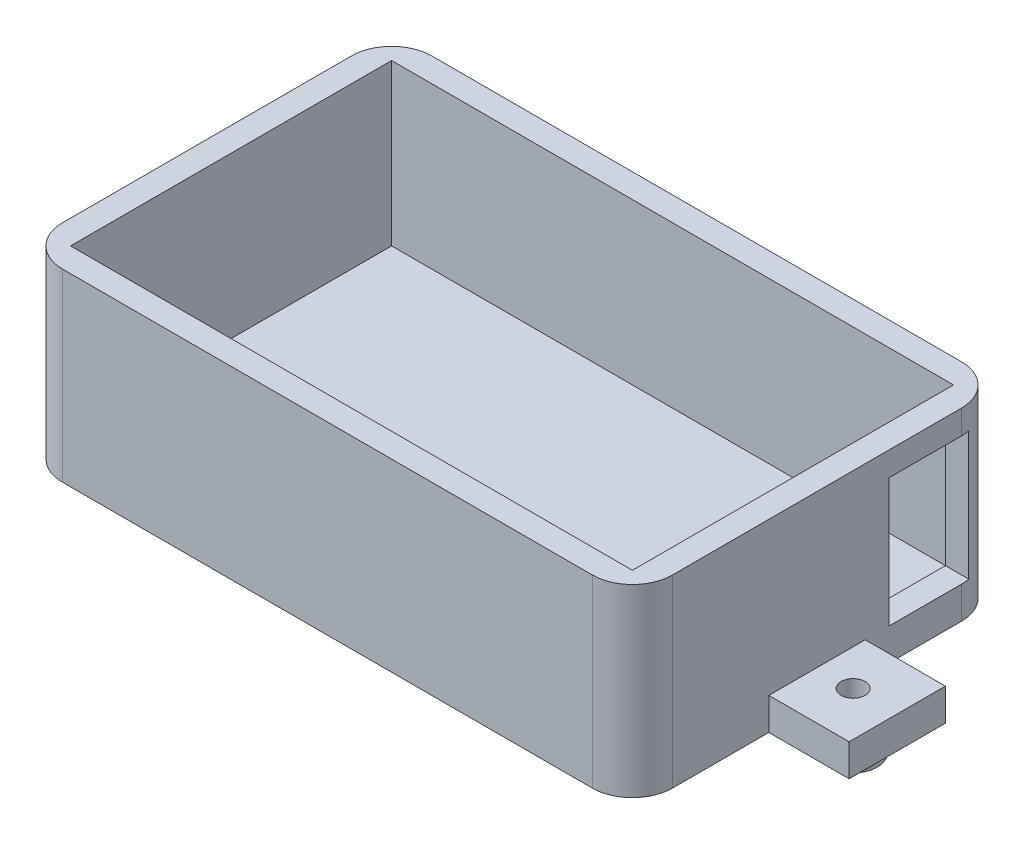
ISO-10303-21;
HEADER;
FILE_DESCRIPTION(('STEP AP214'),'2;1');
FILE_NAME('part.step','',(''),(''),'','','');
FILE_SCHEMA(('AUTOMOTIVE_DESIGN { 1 0 10303 214 1 1 1 1 }'));
ENDSEC;
DATA;
#1=APPLICATION_CONTEXT('core data for automotive mechanical design processes');
#2=APPLICATION_PROTOCOL_DEFINITION('international standard','automotive_design',2000,#1);
#3=PRODUCT_CONTEXT('',#1,'mechanical');
#4=PRODUCT('Part','Part','',(#3));
#5=PRODUCT_RELATED_PRODUCT_CATEGORY('part','',(#4));
#6=PRODUCT_DEFINITION_FORMATION('','',#4);
#7=PRODUCT_DEFINITION_CONTEXT('part definition',#1,'design');
#8=PRODUCT_DEFINITION('design','',#6,#7);
#9=PRODUCT_DEFINITION_SHAPE('','',#8);
#10=(LENGTH_UNIT() NAMED_UNIT(*) SI_UNIT(.MILLI.,.METRE.));
#11=(NAMED_UNIT(*) PLANE_ANGLE_UNIT() SI_UNIT($,.RADIAN.));
#12=(NAMED_UNIT(*) SI_UNIT($,.STERADIAN.) SOLID_ANGLE_UNIT());
#13=UNCERTAINTY_MEASURE_WITH_UNIT(LENGTH_MEASURE(1.E-05),#10,'distance_accuracy_value','');
#14=(GEOMETRIC_REPRESENTATION_CONTEXT(3) GLOBAL_UNCERTAINTY_ASSIGNED_CONTEXT((#13)) GLOBAL_UNIT_ASSIGNED_CONTEXT((#10,
#11,#12)) REPRESENTATION_CONTEXT('',''));
#15=CARTESIAN_POINT('',(0.,0.,0.));
#16=DIRECTION('',(0.,0.,1.));
#17=DIRECTION('',(1.,0.,0.));
#18=AXIS2_PLACEMENT_3D('',#15,#16,#17);
#19=CARTESIAN_POINT('',(38.,20.,23.));
#20=DIRECTION('',(-1.,0.,0.));
#21=DIRECTION('',(0.,0.,1.));
#22=AXIS2_PLACEMENT_3D('',#19,#20,#21);
#23=PLANE('',#22);
#24=DIRECTION('',(0.,0.,1.));
#25=VECTOR('',#24,1.);
#26=CARTESIAN_POINT('',(38.,-3.,23.));
#27=LINE('',#26,#25);
#28=CARTESIAN_POINT('',(38.,-3.,-18.));
#29=VERTEX_POINT('',#28);
#30=CARTESIAN_POINT('',(38.,-2.99999999999999,-6.));
#31=VERTEX_POINT('',#30);
#32=EDGE_CURVE('E336',#29,#31,#27,.T.);
#33=ORIENTED_EDGE('',*,*,#32,.F.);
#34=DIRECTION('',(0.,-1.,0.));
#35=VECTOR('',#34,1.);
#36=CARTESIAN_POINT('',(38.,20.,-18.));
#37=LINE('',#36,#35);
#38=CARTESIAN_POINT('',(38.,1.00000000000001,-18.));
#39=VERTEX_POINT('',#38);
#40=EDGE_CURVE('E242',#29,#39,#37,.F.);
#41=ORIENTED_EDGE('',*,*,#40,.T.);
#42=DIRECTION('',(0.,0.,1.));
#43=VECTOR('',#42,1.);
#44=CARTESIAN_POINT('',(38.,1.00000000000001,-19.));
#45=LINE('',#44,#43);
#46=CARTESIAN_POINT('',(38.,1.00000000000001,-9.00000000000001));
#47=VERTEX_POINT('',#46);
#48=EDGE_CURVE('E235',#39,#47,#45,.T.);
#49=ORIENTED_EDGE('',*,*,#48,.T.);
#50=DIRECTION('',(0.,-1.,0.));
#51=VECTOR('',#50,1.);
#52=CARTESIAN_POINT('',(38.,17.,-9.00000000000001));
#53=LINE('',#52,#51);
#54=CARTESIAN_POINT('',(38.,17.,-9.00000000000001));
#55=VERTEX_POINT('',#54);
#56=EDGE_CURVE('E240',#55,#47,#53,.T.);
#57=ORIENTED_EDGE('',*,*,#56,.F.);
#58=DIRECTION('',(0.,0.,1.));
#59=VECTOR('',#58,1.);
#60=CARTESIAN_POINT('',(38.,17.,-19.));
#61=LINE('',#60,#59);
#62=CARTESIAN_POINT('',(38.,17.,-18.));
#63=VERTEX_POINT('',#62);
#64=EDGE_CURVE('E260',#63,#55,#61,.T.);
#65=ORIENTED_EDGE('',*,*,#64,.F.);
#66=DIRECTION('',(0.,-1.,0.));
#67=VECTOR('',#66,1.);
#68=CARTESIAN_POINT('',(38.,20.,-18.));
#69=LINE('',#68,#67);
#70=CARTESIAN_POINT('',(38.,20.,-18.));
#71=VERTEX_POINT('',#70);
#72=EDGE_CURVE('E520',#63,#71,#69,.F.);
#73=ORIENTED_EDGE('',*,*,#72,.T.);
#74=DIRECTION('',(0.,0.,-1.));
#75=VECTOR('',#74,1.);
#76=CARTESIAN_POINT('',(38.,20.,23.));
#77=LINE('',#76,#75);
#78=CARTESIAN_POINT('',(38.,20.,18.));
#79=VERTEX_POINT('',#78);
#80=EDGE_CURVE('E387',#79,#71,#77,.T.);
#81=ORIENTED_EDGE('',*,*,#80,.F.);
#82=DIRECTION('',(0.,-1.,0.));
#83=VECTOR('',#82,1.);
#84=CARTESIAN_POINT('',(38.,20.,18.));
#85=LINE('',#84,#83);
#86=CARTESIAN_POINT('',(38.,-3.,18.));
#87=VERTEX_POINT('',#86);
#88=EDGE_CURVE('E516',#79,#87,#85,.T.);
#89=ORIENTED_EDGE('',*,*,#88,.T.);
#90=CARTESIAN_POINT('',(38.,-3.,6.));
#91=VERTEX_POINT('',#90);
#92=EDGE_CURVE('E335',#91,#87,#27,.T.);
#93=ORIENTED_EDGE('',*,*,#92,.F.);
#94=DIRECTION('',(0.,1.,0.));
#95=VECTOR('',#94,1.);
#96=CARTESIAN_POINT('',(38.,-3.,6.));
#97=LINE('',#96,#95);
#98=CARTESIAN_POINT('',(38.,1.,6.));
#99=VERTEX_POINT('',#98);
#100=EDGE_CURVE('E307',#91,#99,#97,.T.);
#101=ORIENTED_EDGE('',*,*,#100,.T.);
#102=DIRECTION('',(0.,0.,1.));
#103=VECTOR('',#102,1.);
#104=CARTESIAN_POINT('',(38.,1.00000000000001,-6.));
#105=LINE('',#104,#103);
#106=CARTESIAN_POINT('',(38.,1.00000000000001,-6.));
#107=VERTEX_POINT('',#106);
#108=EDGE_CURVE('E282',#107,#99,#105,.T.);
#109=ORIENTED_EDGE('',*,*,#108,.F.);
#110=DIRECTION('',(0.,1.,0.));
#111=VECTOR('',#110,1.);
#112=CARTESIAN_POINT('',(38.,-2.99999999999999,-6.));
#113=LINE('',#112,#111);
#114=EDGE_CURVE('E293',#31,#107,#113,.T.);
#115=ORIENTED_EDGE('',*,*,#114,.F.);
#116=EDGE_LOOP('',(#33,#41,#49,#57,#65,#73,#81,#89,#93,#101,#109,#115));
#117=FACE_BOUND('',#116,.T.);
#118=ADVANCED_FACE('F68',(#117),#23,.F.);
#119=CARTESIAN_POINT('',(35.,20.,-20.));
#120=DIRECTION('',(-1.,0.,0.));
#121=DIRECTION('',(0.,0.,1.));
#122=AXIS2_PLACEMENT_3D('',#119,#120,#121);
#123=PLANE('',#122);
#124=DIRECTION('',(0.,0.,-1.));
#125=VECTOR('',#124,1.);
#126=CARTESIAN_POINT('',(35.,0.,-20.));
#127=LINE('',#126,#125);
#128=CARTESIAN_POINT('',(35.,0.,20.));
#129=VERTEX_POINT('',#128);
#130=CARTESIAN_POINT('',(35.,0.,-20.));
#131=VERTEX_POINT('',#130);
#132=EDGE_CURVE('E343',#129,#131,#127,.T.);
#133=ORIENTED_EDGE('',*,*,#132,.F.);
#134=DIRECTION('',(0.,-1.,0.));
#135=VECTOR('',#134,1.);
#136=CARTESIAN_POINT('',(35.,20.,20.));
#137=LINE('',#136,#135);
#138=CARTESIAN_POINT('',(35.,20.,20.));
#139=VERTEX_POINT('',#138);
#140=EDGE_CURVE('E358',#139,#129,#137,.T.);
#141=ORIENTED_EDGE('',*,*,#140,.F.);
#142=DIRECTION('',(0.,0.,-1.));
#143=VECTOR('',#142,1.);
#144=CARTESIAN_POINT('',(35.,20.,-20.));
#145=LINE('',#144,#143);
#146=CARTESIAN_POINT('',(35.,20.,-20.));
#147=VERTEX_POINT('',#146);
#148=EDGE_CURVE('E344',#139,#147,#145,.T.);
#149=ORIENTED_EDGE('',*,*,#148,.T.);
#150=DIRECTION('',(0.,-1.,0.));
#151=VECTOR('',#150,1.);
#152=CARTESIAN_POINT('',(35.,20.,-20.));
#153=LINE('',#152,#151);
#154=EDGE_CURVE('E383',#147,#131,#153,.T.);
#155=ORIENTED_EDGE('',*,*,#154,.T.);
#156=EDGE_LOOP('',(#133,#141,#149,#155));
#157=FACE_BOUND('',#156,.T.);
#158=DIRECTION('',(0.,1.,0.));
#159=VECTOR('',#158,1.);
#160=CARTESIAN_POINT('',(35.,20.,-9.00000000000001));
#161=LINE('',#160,#159);
#162=CARTESIAN_POINT('',(35.,1.00000000000001,-9.00000000000001));
#163=VERTEX_POINT('',#162);
#164=CARTESIAN_POINT('',(35.,17.,-9.00000000000001));
#165=VERTEX_POINT('',#164);
#166=EDGE_CURVE('E466',#163,#165,#161,.T.);
#167=ORIENTED_EDGE('',*,*,#166,.F.);
#168=DIRECTION('',(0.,0.,-1.));
#169=VECTOR('',#168,1.);
#170=CARTESIAN_POINT('',(35.,1.,-20.));
#171=LINE('',#170,#169);
#172=CARTESIAN_POINT('',(35.,1.00000000000001,-19.));
#173=VERTEX_POINT('',#172);
#174=EDGE_CURVE('E249',#163,#173,#171,.T.);
#175=ORIENTED_EDGE('',*,*,#174,.T.);
#176=DIRECTION('',(0.,1.,0.));
#177=VECTOR('',#176,1.);
#178=CARTESIAN_POINT('',(35.,20.,-19.));
#179=LINE('',#178,#177);
#180=CARTESIAN_POINT('',(35.,17.,-19.));
#181=VERTEX_POINT('',#180);
#182=EDGE_CURVE('E445',#173,#181,#179,.T.);
#183=ORIENTED_EDGE('',*,*,#182,.T.);
#184=DIRECTION('',(0.,0.,-1.));
#185=VECTOR('',#184,1.);
#186=CARTESIAN_POINT('',(35.,17.,-20.));
#187=LINE('',#186,#185);
#188=EDGE_CURVE('E462',#165,#181,#187,.T.);
#189=ORIENTED_EDGE('',*,*,#188,.F.);
#190=EDGE_LOOP('',(#167,#175,#183,#189));
#191=FACE_BOUND('',#190,.T.);
#192=ADVANCED_FACE('F608',(#157,#191),#123,.T.);
#193=CARTESIAN_POINT('',(-42.5,1.,0.));
#194=DIRECTION('',(0.,-1.,0.));
#195=DIRECTION('',(0.,0.,-1.));
#196=AXIS2_PLACEMENT_3D('',#193,#194,#195);
#197=CYLINDRICAL_SURFACE('',#196,3.);
#198=CARTESIAN_POINT('',(-42.5,-3.,0.));
#199=DIRECTION('',(0.,-1.,0.));
#200=DIRECTION('',(0.,0.,-1.));
#201=AXIS2_PLACEMENT_3D('',#198,#199,#200);
#202=CIRCLE('',#201,3.);
#203=CARTESIAN_POINT('',(-42.5,-3.,-3.00000000000001));
#204=VERTEX_POINT('',#203);
#205=EDGE_CURVE('E441',#204,#204,#202,.F.);
#206=ORIENTED_EDGE('',*,*,#205,.F.);
#207=EDGE_LOOP('',(#206));
#208=FACE_BOUND('',#207,.T.);
#209=CARTESIAN_POINT('',(-42.5,-6.,0.));
#210=DIRECTION('',(0.,-1.,0.));
#211=DIRECTION('',(0.,0.,-1.));
#212=AXIS2_PLACEMENT_3D('',#209,#210,#211);
#213=CIRCLE('',#212,3.);
#214=CARTESIAN_POINT('',(-42.5,-6.,-3.00000000000001));
#215=VERTEX_POINT('',#214);
#216=EDGE_CURVE('E446',#215,#215,#213,.T.);
#217=ORIENTED_EDGE('',*,*,#216,.F.);
#218=EDGE_LOOP('',(#217));
#219=FACE_BOUND('',#218,.T.);
#220=ADVANCED_FACE('F614',(#208,#219),#197,.T.);
#221=CARTESIAN_POINT('',(-42.5,1.,0.));
#222=DIRECTION('',(0.,-1.,0.));
#223=DIRECTION('',(0.,0.,-1.));
#224=AXIS2_PLACEMENT_3D('',#221,#222,#223);
#225=CYLINDRICAL_SURFACE('',#224,1.5);
#226=CARTESIAN_POINT('',(-42.5,-6.,0.));
#227=DIRECTION('',(0.,-1.,0.));
#228=DIRECTION('',(0.,0.,-1.));
#229=AXIS2_PLACEMENT_3D('',#226,#227,#228);
#230=CIRCLE('',#229,1.5);
#231=CARTESIAN_POINT('',(-42.5,-6.,-1.50000000000001));
#232=VERTEX_POINT('',#231);
#233=EDGE_CURVE('E440',#232,#232,#230,.T.);
#234=ORIENTED_EDGE('',*,*,#233,.T.);
#235=EDGE_LOOP('',(#234));
#236=FACE_BOUND('',#235,.T.);
#237=CARTESIAN_POINT('',(-42.5,1.,0.));
#238=DIRECTION('',(0.,-1.,0.));
#239=DIRECTION('',(0.,0.,-1.));
#240=AXIS2_PLACEMENT_3D('',#237,#238,#239);
#241=CIRCLE('',#240,1.5);
#242=CARTESIAN_POINT('',(-42.5,1.,-1.50000000000001));
#243=VERTEX_POINT('',#242);
#244=EDGE_CURVE('E278',#243,#243,#241,.T.);
#245=ORIENTED_EDGE('',*,*,#244,.F.);
#246=EDGE_LOOP('',(#245));
#247=FACE_BOUND('',#246,.T.);
#248=ADVANCED_FACE('F604',(#236,#247),#225,.F.);
#249=CARTESIAN_POINT('',(-42.5,-6.,0.));
#250=DIRECTION('',(0.,-1.,0.));
#251=DIRECTION('',(0.,0.,-1.));
#252=AXIS2_PLACEMENT_3D('',#249,#250,#251);
#253=PLANE('',#252);
#254=ORIENTED_EDGE('',*,*,#216,.T.);
#255=EDGE_LOOP('',(#254));
#256=FACE_BOUND('',#255,.T.);
#257=ORIENTED_EDGE('',*,*,#233,.F.);
#258=EDGE_LOOP('',(#257));
#259=FACE_BOUND('',#258,.T.);
#260=ADVANCED_FACE('F594',(#256,#259),#253,.T.);
#261=CARTESIAN_POINT('',(-48.,-3.,-6.));
#262=DIRECTION('',(0.,0.,-1.));
#263=DIRECTION('',(-1.,0.,0.));
#264=AXIS2_PLACEMENT_3D('',#261,#262,#263);
#265=PLANE('',#264);
#266=DIRECTION('',(0.,1.,0.));
#267=VECTOR('',#266,1.);
#268=CARTESIAN_POINT('',(-38.,-3.,-6.));
#269=LINE('',#268,#267);
#270=CARTESIAN_POINT('',(-38.,-3.,-6.));
#271=VERTEX_POINT('',#270);
#272=CARTESIAN_POINT('',(-38.,1.,-6.));
#273=VERTEX_POINT('',#272);
#274=EDGE_CURVE('E420',#271,#273,#269,.T.);
#275=ORIENTED_EDGE('',*,*,#274,.F.);
#276=DIRECTION('',(1.,0.,0.));
#277=VECTOR('',#276,1.);
#278=CARTESIAN_POINT('',(-48.,-3.,-6.));
#279=LINE('',#278,#277);
#280=CARTESIAN_POINT('',(-48.,-3.,-6.));
#281=VERTEX_POINT('',#280);
#282=EDGE_CURVE('E433',#281,#271,#279,.T.);
#283=ORIENTED_EDGE('',*,*,#282,.F.);
#284=DIRECTION('',(0.,1.,0.));
#285=VECTOR('',#284,1.);
#286=CARTESIAN_POINT('',(-48.,-3.,-6.));
#287=LINE('',#286,#285);
#288=CARTESIAN_POINT('',(-48.,1.,-6.));
#289=VERTEX_POINT('',#288);
#290=EDGE_CURVE('E405',#281,#289,#287,.T.);
#291=ORIENTED_EDGE('',*,*,#290,.T.);
#292=DIRECTION('',(1.,0.,0.));
#293=VECTOR('',#292,1.);
#294=CARTESIAN_POINT('',(-48.,1.,-6.));
#295=LINE('',#294,#293);
#296=EDGE_CURVE('E436',#289,#273,#295,.T.);
#297=ORIENTED_EDGE('',*,*,#296,.T.);
#298=EDGE_LOOP('',(#275,#283,#291,#297));
#299=FACE_BOUND('',#298,.T.);
#300=ADVANCED_FACE('F592',(#299),#265,.T.);
#301=CARTESIAN_POINT('',(-48.,-2.99999999999999,6.));
#302=DIRECTION('',(0.,-1.,0.));
#303=DIRECTION('',(0.,0.,-1.));
#304=AXIS2_PLACEMENT_3D('',#301,#302,#303);
#305=PLANE('',#304);
#306=ORIENTED_EDGE('',*,*,#205,.T.);
#307=EDGE_LOOP('',(#306));
#308=FACE_BOUND('',#307,.T.);
#309=DIRECTION('',(-1.,0.,0.));
#310=VECTOR('',#309,1.);
#311=CARTESIAN_POINT('',(-38.,-3.,23.));
#312=LINE('',#311,#310);
#313=CARTESIAN_POINT('',(33.,-3.,23.));
#314=VERTEX_POINT('',#313);
#315=CARTESIAN_POINT('',(-33.,-3.,23.));
#316=VERTEX_POINT('',#315);
#317=EDGE_CURVE('E339',#314,#316,#312,.T.);
#318=ORIENTED_EDGE('',*,*,#317,.T.);
#319=CARTESIAN_POINT('',(-33.,-2.99999999999999,18.));
#320=DIRECTION('',(0.,-1.,0.));
#321=DIRECTION('',(0.,0.,-1.));
#322=AXIS2_PLACEMENT_3D('',#319,#320,#321);
#323=CIRCLE('',#322,5.);
#324=CARTESIAN_POINT('',(-38.,-3.,18.));
#325=VERTEX_POINT('',#324);
#326=EDGE_CURVE('E487',#316,#325,#323,.T.);
#327=ORIENTED_EDGE('',*,*,#326,.T.);
#328=DIRECTION('',(0.,0.,-1.));
#329=VECTOR('',#328,1.);
#330=CARTESIAN_POINT('',(-38.,-3.,23.));
#331=LINE('',#330,#329);
#332=CARTESIAN_POINT('',(-38.,-2.99999999999999,6.));
#333=VERTEX_POINT('',#332);
#334=EDGE_CURVE('E328',#325,#333,#331,.T.);
#335=ORIENTED_EDGE('',*,*,#334,.T.);
#336=DIRECTION('',(1.,0.,0.));
#337=VECTOR('',#336,1.);
#338=CARTESIAN_POINT('',(-48.,-2.99999999999999,6.));
#339=LINE('',#338,#337);
#340=CARTESIAN_POINT('',(-48.,-2.99999999999999,6.));
#341=VERTEX_POINT('',#340);
#342=EDGE_CURVE('E429',#341,#333,#339,.T.);
#343=ORIENTED_EDGE('',*,*,#342,.F.);
#344=DIRECTION('',(0.,0.,-1.));
#345=VECTOR('',#344,1.);
#346=CARTESIAN_POINT('',(-48.,-2.99999999999999,6.));
#347=LINE('',#346,#345);
#348=EDGE_CURVE('E410',#341,#281,#347,.T.);
#349=ORIENTED_EDGE('',*,*,#348,.T.);
#350=ORIENTED_EDGE('',*,*,#282,.T.);
#351=CARTESIAN_POINT('',(-38.,-3.,-18.));
#352=VERTEX_POINT('',#351);
#353=EDGE_CURVE('E327',#271,#352,#331,.T.);
#354=ORIENTED_EDGE('',*,*,#353,.T.);
#355=CARTESIAN_POINT('',(-33.,-3.,-18.));
#356=DIRECTION('',(0.,-1.,0.));
#357=DIRECTION('',(0.,0.,-1.));
#358=AXIS2_PLACEMENT_3D('',#355,#356,#357);
#359=CIRCLE('',#358,5.);
#360=CARTESIAN_POINT('',(-33.,-3.,-23.));
#361=VERTEX_POINT('',#360);
#362=EDGE_CURVE('E484',#352,#361,#359,.T.);
#363=ORIENTED_EDGE('',*,*,#362,.T.);
#364=DIRECTION('',(1.,0.,0.));
#365=VECTOR('',#364,1.);
#366=CARTESIAN_POINT('',(-38.,-3.,-23.));
#367=LINE('',#366,#365);
#368=CARTESIAN_POINT('',(33.,-3.,-23.));
#369=VERTEX_POINT('',#368);
#370=EDGE_CURVE('E331',#361,#369,#367,.T.);
#371=ORIENTED_EDGE('',*,*,#370,.T.);
#372=CARTESIAN_POINT('',(33.,-3.,-18.));
#373=DIRECTION('',(0.,-1.,0.));
#374=DIRECTION('',(0.,0.,-1.));
#375=AXIS2_PLACEMENT_3D('',#372,#373,#374);
#376=CIRCLE('',#375,5.);
#377=EDGE_CURVE('E481',#369,#29,#376,.T.);
#378=ORIENTED_EDGE('',*,*,#377,.T.);
#379=ORIENTED_EDGE('',*,*,#32,.T.);
#380=DIRECTION('',(-1.,0.,0.));
#381=VECTOR('',#380,1.);
#382=CARTESIAN_POINT('',(48.,-2.99999999999999,-6.));
#383=LINE('',#382,#381);
#384=CARTESIAN_POINT('',(48.,-2.99999999999999,-6.));
#385=VERTEX_POINT('',#384);
#386=EDGE_CURVE('E316',#385,#31,#383,.T.);
#387=ORIENTED_EDGE('',*,*,#386,.F.);
#388=DIRECTION('',(0.,0.,1.));
#389=VECTOR('',#388,1.);
#390=CARTESIAN_POINT('',(48.,-2.99999999999999,-6.));
#391=LINE('',#390,#389);
#392=CARTESIAN_POINT('',(48.,-3.,6.));
#393=VERTEX_POINT('',#392);
#394=EDGE_CURVE('E297',#385,#393,#391,.T.);
#395=ORIENTED_EDGE('',*,*,#394,.T.);
#396=DIRECTION('',(-1.,0.,0.));
#397=VECTOR('',#396,1.);
#398=CARTESIAN_POINT('',(48.,-3.,6.));
#399=LINE('',#398,#397);
#400=EDGE_CURVE('E320',#393,#91,#399,.T.);
#401=ORIENTED_EDGE('',*,*,#400,.T.);
#402=ORIENTED_EDGE('',*,*,#92,.T.);
#403=CARTESIAN_POINT('',(33.,-2.99999999999999,18.));
#404=DIRECTION('',(0.,-1.,0.));
#405=DIRECTION('',(0.,0.,-1.));
#406=AXIS2_PLACEMENT_3D('',#403,#404,#405);
#407=CIRCLE('',#406,5.);
#408=EDGE_CURVE('E478',#87,#314,#407,.T.);
#409=ORIENTED_EDGE('',*,*,#408,.T.);
#410=EDGE_LOOP('',(#318,#327,#335,#343,#349,#350,#354,#363,#371,#378,#379,#387,#395,#401,#402,#409));
#411=FACE_BOUND('',#410,.T.);
#412=CARTESIAN_POINT('',(42.5,-3.,0.));
#413=DIRECTION('',(0.,-1.,0.));
#414=DIRECTION('',(0.,0.,-1.));
#415=AXIS2_PLACEMENT_3D('',#412,#413,#414);
#416=CIRCLE('',#415,2.99999999999999);
#417=CARTESIAN_POINT('',(42.5,-3.,-2.99999999999999));
#418=VERTEX_POINT('',#417);
#419=EDGE_CURVE('E283',#418,#418,#416,.T.);
#420=ORIENTED_EDGE('',*,*,#419,.F.);
#421=EDGE_LOOP('',(#420));
#422=FACE_BOUND('',#421,.T.);
#423=ADVANCED_FACE('F533',(#308,#411,#422),#305,.T.);
#424=CARTESIAN_POINT('',(-48.,-2.99999999999999,6.));
#425=DIRECTION('',(0.,0.,-1.));
#426=DIRECTION('',(-1.,0.,0.));
#427=AXIS2_PLACEMENT_3D('',#424,#425,#426);
#428=PLANE('',#427);
#429=DIRECTION('',(0.,1.,0.));
#430=VECTOR('',#429,1.);
#431=CARTESIAN_POINT('',(-38.,-2.99999999999999,6.));
#432=LINE('',#431,#430);
#433=CARTESIAN_POINT('',(-38.,1.00000000000001,6.));
#434=VERTEX_POINT('',#433);
#435=EDGE_CURVE('E406',#333,#434,#432,.T.);
#436=ORIENTED_EDGE('',*,*,#435,.T.);
#437=DIRECTION('',(1.,0.,0.));
#438=VECTOR('',#437,1.);
#439=CARTESIAN_POINT('',(-48.,1.00000000000001,6.));
#440=LINE('',#439,#438);
#441=CARTESIAN_POINT('',(-48.,1.00000000000001,6.));
#442=VERTEX_POINT('',#441);
#443=EDGE_CURVE('E417',#442,#434,#440,.T.);
#444=ORIENTED_EDGE('',*,*,#443,.F.);
#445=DIRECTION('',(0.,1.,0.));
#446=VECTOR('',#445,1.);
#447=CARTESIAN_POINT('',(-48.,-2.99999999999999,6.));
#448=LINE('',#447,#446);
#449=EDGE_CURVE('E414',#341,#442,#448,.T.);
#450=ORIENTED_EDGE('',*,*,#449,.F.);
#451=ORIENTED_EDGE('',*,*,#342,.T.);
#452=EDGE_LOOP('',(#436,#444,#450,#451));
#453=FACE_BOUND('',#452,.T.);
#454=ADVANCED_FACE('F581',(#453),#428,.F.);
#455=CARTESIAN_POINT('',(-48.,0.,0.));
#456=DIRECTION('',(1.,0.,0.));
#457=DIRECTION('',(0.,0.,-1.));
#458=AXIS2_PLACEMENT_3D('',#455,#456,#457);
#459=PLANE('',#458);
#460=DIRECTION('',(0.,0.,-1.));
#461=VECTOR('',#460,1.);
#462=CARTESIAN_POINT('',(-48.,1.00000000000001,6.));
#463=LINE('',#462,#461);
#464=EDGE_CURVE('E402',#442,#289,#463,.T.);
#465=ORIENTED_EDGE('',*,*,#464,.T.);
#466=ORIENTED_EDGE('',*,*,#290,.F.);
#467=ORIENTED_EDGE('',*,*,#348,.F.);
#468=ORIENTED_EDGE('',*,*,#449,.T.);
#469=EDGE_LOOP('',(#465,#466,#467,#468));
#470=FACE_BOUND('',#469,.T.);
#471=ADVANCED_FACE('F589',(#470),#459,.F.);
#472=CARTESIAN_POINT('',(-42.5,1.,0.));
#473=DIRECTION('',(0.,-1.,0.));
#474=DIRECTION('',(0.,0.,-1.));
#475=AXIS2_PLACEMENT_3D('',#472,#473,#474);
#476=PLANE('',#475);
#477=ORIENTED_EDGE('',*,*,#244,.T.);
#478=EDGE_LOOP('',(#477));
#479=FACE_BOUND('',#478,.T.);
#480=DIRECTION('',(0.,0.,-1.));
#481=VECTOR('',#480,1.);
#482=CARTESIAN_POINT('',(-38.,1.00000000000001,6.));
#483=LINE('',#482,#481);
#484=EDGE_CURVE('E287',#434,#273,#483,.T.);
#485=ORIENTED_EDGE('',*,*,#484,.T.);
#486=ORIENTED_EDGE('',*,*,#296,.F.);
#487=ORIENTED_EDGE('',*,*,#464,.F.);
#488=ORIENTED_EDGE('',*,*,#443,.T.);
#489=EDGE_LOOP('',(#485,#486,#487,#488));
#490=FACE_BOUND('',#489,.T.);
#491=ADVANCED_FACE('F585',(#479,#490),#476,.F.);
#492=CARTESIAN_POINT('',(0.,20.,0.));
#493=DIRECTION('',(0.,-1.,0.));
#494=DIRECTION('',(0.,0.,-1.));
#495=AXIS2_PLACEMENT_3D('',#492,#493,#494);
#496=PLANE('',#495);
#497=DIRECTION('',(0.,0.,1.));
#498=VECTOR('',#497,1.);
#499=CARTESIAN_POINT('',(-38.,20.,23.));
#500=LINE('',#499,#498);
#501=CARTESIAN_POINT('',(-38.,20.,-18.));
#502=VERTEX_POINT('',#501);
#503=CARTESIAN_POINT('',(-38.,20.,18.));
#504=VERTEX_POINT('',#503);
#505=EDGE_CURVE('E395',#502,#504,#500,.T.);
#506=ORIENTED_EDGE('',*,*,#505,.T.);
#507=CARTESIAN_POINT('',(-33.,20.,18.));
#508=DIRECTION('',(0.,-1.,0.));
#509=DIRECTION('',(0.,0.,-1.));
#510=AXIS2_PLACEMENT_3D('',#507,#508,#509);
#511=CIRCLE('',#510,5.);
#512=CARTESIAN_POINT('',(-33.,20.,23.));
#513=VERTEX_POINT('',#512);
#514=EDGE_CURVE('E506',#504,#513,#511,.F.);
#515=ORIENTED_EDGE('',*,*,#514,.T.);
#516=DIRECTION('',(1.,0.,0.));
#517=VECTOR('',#516,1.);
#518=CARTESIAN_POINT('',(-38.,20.,23.));
#519=LINE('',#518,#517);
#520=CARTESIAN_POINT('',(33.,20.,23.));
#521=VERTEX_POINT('',#520);
#522=EDGE_CURVE('E288',#513,#521,#519,.T.);
#523=ORIENTED_EDGE('',*,*,#522,.T.);
#524=CARTESIAN_POINT('',(33.,20.,18.));
#525=DIRECTION('',(0.,-1.,0.));
#526=DIRECTION('',(0.,0.,-1.));
#527=AXIS2_PLACEMENT_3D('',#524,#525,#526);
#528=CIRCLE('',#527,5.);
#529=EDGE_CURVE('E497',#521,#79,#528,.F.);
#530=ORIENTED_EDGE('',*,*,#529,.T.);
#531=ORIENTED_EDGE('',*,*,#80,.T.);
#532=CARTESIAN_POINT('',(33.,20.,-18.));
#533=DIRECTION('',(0.,-1.,0.));
#534=DIRECTION('',(0.,0.,-1.));
#535=AXIS2_PLACEMENT_3D('',#532,#533,#534);
#536=CIRCLE('',#535,5.);
#537=CARTESIAN_POINT('',(33.,20.,-23.));
#538=VERTEX_POINT('',#537);
#539=EDGE_CURVE('E500',#71,#538,#536,.F.);
#540=ORIENTED_EDGE('',*,*,#539,.T.);
#541=DIRECTION('',(-1.,0.,0.));
#542=VECTOR('',#541,1.);
#543=CARTESIAN_POINT('',(-38.,20.,-23.));
#544=LINE('',#543,#542);
#545=CARTESIAN_POINT('',(-33.,20.,-23.));
#546=VERTEX_POINT('',#545);
#547=EDGE_CURVE('E391',#538,#546,#544,.T.);
#548=ORIENTED_EDGE('',*,*,#547,.T.);
#549=CARTESIAN_POINT('',(-33.,20.,-18.));
#550=DIRECTION('',(0.,-1.,0.));
#551=DIRECTION('',(0.,0.,-1.));
#552=AXIS2_PLACEMENT_3D('',#549,#550,#551);
#553=CIRCLE('',#552,5.);
#554=EDGE_CURVE('E503',#546,#502,#553,.F.);
#555=ORIENTED_EDGE('',*,*,#554,.T.);
#556=EDGE_LOOP('',(#506,#515,#523,#530,#531,#540,#548,#555));
#557=FACE_BOUND('',#556,.T.);
#558=ORIENTED_EDGE('',*,*,#148,.F.);
#559=DIRECTION('',(1.,0.,0.));
#560=VECTOR('',#559,1.);
#561=CARTESIAN_POINT('',(-35.,20.,20.));
#562=LINE('',#561,#560);
#563=CARTESIAN_POINT('',(-35.,20.,20.));
#564=VERTEX_POINT('',#563);
#565=EDGE_CURVE('E355',#564,#139,#562,.T.);
#566=ORIENTED_EDGE('',*,*,#565,.F.);
#567=DIRECTION('',(0.,0.,1.));
#568=VECTOR('',#567,1.);
#569=CARTESIAN_POINT('',(-35.,20.,-20.));
#570=LINE('',#569,#568);
#571=CARTESIAN_POINT('',(-35.,20.,-20.));
#572=VERTEX_POINT('',#571);
#573=EDGE_CURVE('E351',#572,#564,#570,.T.);
#574=ORIENTED_EDGE('',*,*,#573,.F.);
#575=DIRECTION('',(-1.,0.,0.));
#576=VECTOR('',#575,1.);
#577=CARTESIAN_POINT('',(-35.,20.,-20.));
#578=LINE('',#577,#576);
#579=EDGE_CURVE('E347',#147,#572,#578,.T.);
#580=ORIENTED_EDGE('',*,*,#579,.F.);
#581=EDGE_LOOP('',(#558,#566,#574,#580));
#582=FACE_BOUND('',#581,.T.);
#583=ADVANCED_FACE('F552',(#557,#582),#496,.F.);
#584=CARTESIAN_POINT('',(-38.,20.,-23.));
#585=DIRECTION('',(0.,0.,1.));
#586=DIRECTION('',(1.,0.,0.));
#587=AXIS2_PLACEMENT_3D('',#584,#585,#586);
#588=PLANE('',#587);
#589=ORIENTED_EDGE('',*,*,#370,.F.);
#590=DIRECTION('',(0.,-1.,0.));
#591=VECTOR('',#590,1.);
#592=CARTESIAN_POINT('',(-33.,20.,-23.));
#593=LINE('',#592,#591);
#594=EDGE_CURVE('E513',#361,#546,#593,.F.);
#595=ORIENTED_EDGE('',*,*,#594,.T.);
#596=ORIENTED_EDGE('',*,*,#547,.F.);
#597=DIRECTION('',(0.,-1.,0.));
#598=VECTOR('',#597,1.);
#599=CARTESIAN_POINT('',(33.,20.,-23.));
#600=LINE('',#599,#598);
#601=EDGE_CURVE('E509',#538,#369,#600,.T.);
#602=ORIENTED_EDGE('',*,*,#601,.T.);
#603=EDGE_LOOP('',(#589,#595,#596,#602));
#604=FACE_BOUND('',#603,.T.);
#605=ADVANCED_FACE('F549',(#604),#588,.F.);
#606=CARTESIAN_POINT('',(-38.,20.,23.));
#607=DIRECTION('',(1.,0.,0.));
#608=DIRECTION('',(0.,0.,-1.));
#609=AXIS2_PLACEMENT_3D('',#606,#607,#608);
#610=PLANE('',#609);
#611=ORIENTED_EDGE('',*,*,#334,.F.);
#612=DIRECTION('',(0.,-1.,0.));
#613=VECTOR('',#612,1.);
#614=CARTESIAN_POINT('',(-38.,20.,18.));
#615=LINE('',#614,#613);
#616=EDGE_CURVE('E494',#325,#504,#615,.F.);
#617=ORIENTED_EDGE('',*,*,#616,.T.);
#618=ORIENTED_EDGE('',*,*,#505,.F.);
#619=DIRECTION('',(0.,-1.,0.));
#620=VECTOR('',#619,1.);
#621=CARTESIAN_POINT('',(-38.,20.,-18.));
#622=LINE('',#621,#620);
#623=EDGE_CURVE('E490',#502,#352,#622,.T.);
#624=ORIENTED_EDGE('',*,*,#623,.T.);
#625=ORIENTED_EDGE('',*,*,#353,.F.);
#626=ORIENTED_EDGE('',*,*,#274,.T.);
#627=ORIENTED_EDGE('',*,*,#484,.F.);
#628=ORIENTED_EDGE('',*,*,#435,.F.);
#629=EDGE_LOOP('',(#611,#617,#618,#624,#625,#626,#627,#628));
#630=FACE_BOUND('',#629,.T.);
#631=ADVANCED_FACE('F539',(#630),#610,.F.);
#632=CARTESIAN_POINT('',(-38.,20.,23.));
#633=DIRECTION('',(0.,0.,-1.));
#634=DIRECTION('',(-1.,0.,0.));
#635=AXIS2_PLACEMENT_3D('',#632,#633,#634);
#636=PLANE('',#635);
#637=ORIENTED_EDGE('',*,*,#522,.F.);
#638=DIRECTION('',(0.,-1.,0.));
#639=VECTOR('',#638,1.);
#640=CARTESIAN_POINT('',(-33.,20.,23.));
#641=LINE('',#640,#639);
#642=EDGE_CURVE('E474',#513,#316,#641,.T.);
#643=ORIENTED_EDGE('',*,*,#642,.T.);
#644=ORIENTED_EDGE('',*,*,#317,.F.);
#645=DIRECTION('',(0.,-1.,0.));
#646=VECTOR('',#645,1.);
#647=CARTESIAN_POINT('',(33.,20.,23.));
#648=LINE('',#647,#646);
#649=EDGE_CURVE('E471',#314,#521,#648,.F.);
#650=ORIENTED_EDGE('',*,*,#649,.T.);
#651=EDGE_LOOP('',(#637,#643,#644,#650));
#652=FACE_BOUND('',#651,.T.);
#653=ADVANCED_FACE('F572',(#652),#636,.F.);
#654=CARTESIAN_POINT('',(-35.,20.,-20.));
#655=DIRECTION('',(0.,0.,1.));
#656=DIRECTION('',(1.,0.,0.));
#657=AXIS2_PLACEMENT_3D('',#654,#655,#656);
#658=PLANE('',#657);
#659=DIRECTION('',(-1.,0.,0.));
#660=VECTOR('',#659,1.);
#661=CARTESIAN_POINT('',(-35.,0.,-20.));
#662=LINE('',#661,#660);
#663=CARTESIAN_POINT('',(-35.,0.,-20.));
#664=VERTEX_POINT('',#663);
#665=EDGE_CURVE('E362',#131,#664,#662,.T.);
#666=ORIENTED_EDGE('',*,*,#665,.F.);
#667=ORIENTED_EDGE('',*,*,#154,.F.);
#668=ORIENTED_EDGE('',*,*,#579,.T.);
#669=DIRECTION('',(0.,-1.,0.));
#670=VECTOR('',#669,1.);
#671=CARTESIAN_POINT('',(-35.,20.,-20.));
#672=LINE('',#671,#670);
#673=EDGE_CURVE('E380',#572,#664,#672,.T.);
#674=ORIENTED_EDGE('',*,*,#673,.T.);
#675=EDGE_LOOP('',(#666,#667,#668,#674));
#676=FACE_BOUND('',#675,.T.);
#677=ADVANCED_FACE('F635',(#676),#658,.T.);
#678=CARTESIAN_POINT('',(-35.,20.,-20.));
#679=DIRECTION('',(1.,0.,0.));
#680=DIRECTION('',(0.,0.,-1.));
#681=AXIS2_PLACEMENT_3D('',#678,#679,#680);
#682=PLANE('',#681);
#683=DIRECTION('',(0.,0.,1.));
#684=VECTOR('',#683,1.);
#685=CARTESIAN_POINT('',(-35.,0.,-20.));
#686=LINE('',#685,#684);
#687=CARTESIAN_POINT('',(-35.,0.,20.));
#688=VERTEX_POINT('',#687);
#689=EDGE_CURVE('E366',#664,#688,#686,.T.);
#690=ORIENTED_EDGE('',*,*,#689,.F.);
#691=ORIENTED_EDGE('',*,*,#673,.F.);
#692=ORIENTED_EDGE('',*,*,#573,.T.);
#693=DIRECTION('',(0.,-1.,0.));
#694=VECTOR('',#693,1.);
#695=CARTESIAN_POINT('',(-35.,20.,20.));
#696=LINE('',#695,#694);
#697=EDGE_CURVE('E376',#564,#688,#696,.T.);
#698=ORIENTED_EDGE('',*,*,#697,.T.);
#699=EDGE_LOOP('',(#690,#691,#692,#698));
#700=FACE_BOUND('',#699,.T.);
#701=ADVANCED_FACE('F639',(#700),#682,.T.);
#702=CARTESIAN_POINT('',(-35.,20.,20.));
#703=DIRECTION('',(0.,0.,-1.));
#704=DIRECTION('',(-1.,0.,0.));
#705=AXIS2_PLACEMENT_3D('',#702,#703,#704);
#706=PLANE('',#705);
#707=DIRECTION('',(1.,0.,0.));
#708=VECTOR('',#707,1.);
#709=CARTESIAN_POINT('',(-35.,0.,20.));
#710=LINE('',#709,#708);
#711=EDGE_CURVE('E348',#688,#129,#710,.T.);
#712=ORIENTED_EDGE('',*,*,#711,.F.);
#713=ORIENTED_EDGE('',*,*,#697,.F.);
#714=ORIENTED_EDGE('',*,*,#565,.T.);
#715=ORIENTED_EDGE('',*,*,#140,.T.);
#716=EDGE_LOOP('',(#712,#713,#714,#715));
#717=FACE_BOUND('',#716,.T.);
#718=ADVANCED_FACE('F648',(#717),#706,.T.);
#719=CARTESIAN_POINT('',(0.,0.,0.));
#720=DIRECTION('',(0.,-1.,0.));
#721=DIRECTION('',(0.,0.,-1.));
#722=AXIS2_PLACEMENT_3D('',#719,#720,#721);
#723=PLANE('',#722);
#724=ORIENTED_EDGE('',*,*,#689,.T.);
#725=ORIENTED_EDGE('',*,*,#711,.T.);
#726=ORIENTED_EDGE('',*,*,#132,.T.);
#727=ORIENTED_EDGE('',*,*,#665,.T.);
#728=EDGE_LOOP('',(#724,#725,#726,#727));
#729=FACE_BOUND('',#728,.T.);
#730=ADVANCED_FACE('F656',(#729),#723,.F.);
#731=CARTESIAN_POINT('',(48.,1.00000000000001,-6.));
#732=DIRECTION('',(0.,-1.,0.));
#733=DIRECTION('',(0.,0.,-1.));
#734=AXIS2_PLACEMENT_3D('',#731,#732,#733);
#735=PLANE('',#734);
#736=CARTESIAN_POINT('',(42.5,1.,0.));
#737=DIRECTION('',(0.,-1.,0.));
#738=DIRECTION('',(0.,0.,-1.));
#739=AXIS2_PLACEMENT_3D('',#736,#737,#738);
#740=CIRCLE('',#739,1.5);
#741=CARTESIAN_POINT('',(42.5,1.,-1.5));
#742=VERTEX_POINT('',#741);
#743=EDGE_CURVE('E253',#742,#742,#740,.T.);
#744=ORIENTED_EDGE('',*,*,#743,.T.);
#745=EDGE_LOOP('',(#744));
#746=FACE_BOUND('',#745,.T.);
#747=ORIENTED_EDGE('',*,*,#108,.T.);
#748=DIRECTION('',(-1.,0.,0.));
#749=VECTOR('',#748,1.);
#750=CARTESIAN_POINT('',(48.,1.,6.));
#751=LINE('',#750,#749);
#752=CARTESIAN_POINT('',(48.,1.,6.));
#753=VERTEX_POINT('',#752);
#754=EDGE_CURVE('E323',#753,#99,#751,.T.);
#755=ORIENTED_EDGE('',*,*,#754,.F.);
#756=DIRECTION('',(0.,0.,1.));
#757=VECTOR('',#756,1.);
#758=CARTESIAN_POINT('',(48.,1.00000000000001,-6.));
#759=LINE('',#758,#757);
#760=CARTESIAN_POINT('',(48.,1.00000000000001,-6.));
#761=VERTEX_POINT('',#760);
#762=EDGE_CURVE('E289',#761,#753,#759,.T.);
#763=ORIENTED_EDGE('',*,*,#762,.F.);
#764=DIRECTION('',(-1.,0.,0.));
#765=VECTOR('',#764,1.);
#766=CARTESIAN_POINT('',(48.,1.00000000000001,-6.));
#767=LINE('',#766,#765);
#768=EDGE_CURVE('E304',#761,#107,#767,.T.);
#769=ORIENTED_EDGE('',*,*,#768,.T.);
#770=EDGE_LOOP('',(#747,#755,#763,#769));
#771=FACE_BOUND('',#770,.T.);
#772=ADVANCED_FACE('F664',(#746,#771),#735,.F.);
#773=CARTESIAN_POINT('',(48.,-3.,6.));
#774=DIRECTION('',(0.,0.,1.));
#775=DIRECTION('',(1.,0.,0.));
#776=AXIS2_PLACEMENT_3D('',#773,#774,#775);
#777=PLANE('',#776);
#778=ORIENTED_EDGE('',*,*,#100,.F.);
#779=ORIENTED_EDGE('',*,*,#400,.F.);
#780=DIRECTION('',(0.,1.,0.));
#781=VECTOR('',#780,1.);
#782=CARTESIAN_POINT('',(48.,-3.,6.));
#783=LINE('',#782,#781);
#784=EDGE_CURVE('E292',#393,#753,#783,.T.);
#785=ORIENTED_EDGE('',*,*,#784,.T.);
#786=ORIENTED_EDGE('',*,*,#754,.T.);
#787=EDGE_LOOP('',(#778,#779,#785,#786));
#788=FACE_BOUND('',#787,.T.);
#789=ADVANCED_FACE('F670',(#788),#777,.T.);
#790=CARTESIAN_POINT('',(48.,-2.99999999999999,-6.));
#791=DIRECTION('',(0.,0.,1.));
#792=DIRECTION('',(1.,0.,0.));
#793=AXIS2_PLACEMENT_3D('',#790,#791,#792);
#794=PLANE('',#793);
#795=ORIENTED_EDGE('',*,*,#114,.T.);
#796=ORIENTED_EDGE('',*,*,#768,.F.);
#797=DIRECTION('',(0.,1.,0.));
#798=VECTOR('',#797,1.);
#799=CARTESIAN_POINT('',(48.,-2.99999999999999,-6.));
#800=LINE('',#799,#798);
#801=EDGE_CURVE('E301',#385,#761,#800,.T.);
#802=ORIENTED_EDGE('',*,*,#801,.F.);
#803=ORIENTED_EDGE('',*,*,#386,.T.);
#804=EDGE_LOOP('',(#795,#796,#802,#803));
#805=FACE_BOUND('',#804,.T.);
#806=ADVANCED_FACE('F674',(#805),#794,.F.);
#807=CARTESIAN_POINT('',(48.,0.,0.));
#808=DIRECTION('',(-1.,0.,0.));
#809=DIRECTION('',(0.,0.,1.));
#810=AXIS2_PLACEMENT_3D('',#807,#808,#809);
#811=PLANE('',#810);
#812=ORIENTED_EDGE('',*,*,#762,.T.);
#813=ORIENTED_EDGE('',*,*,#784,.F.);
#814=ORIENTED_EDGE('',*,*,#394,.F.);
#815=ORIENTED_EDGE('',*,*,#801,.T.);
#816=EDGE_LOOP('',(#812,#813,#814,#815));
#817=FACE_BOUND('',#816,.T.);
#818=ADVANCED_FACE('F682',(#817),#811,.F.);
#819=CARTESIAN_POINT('',(42.5,1.,0.));
#820=DIRECTION('',(0.,-1.,0.));
#821=DIRECTION('',(0.,0.,-1.));
#822=AXIS2_PLACEMENT_3D('',#819,#820,#821);
#823=CYLINDRICAL_SURFACE('',#822,2.99999999999999);
#824=ORIENTED_EDGE('',*,*,#419,.T.);
#825=EDGE_LOOP('',(#824));
#826=FACE_BOUND('',#825,.T.);
#827=CARTESIAN_POINT('',(42.5,-6.,0.));
#828=DIRECTION('',(0.,-1.,0.));
#829=DIRECTION('',(0.,0.,-1.));
#830=AXIS2_PLACEMENT_3D('',#827,#828,#829);
#831=CIRCLE('',#830,2.99999999999999);
#832=CARTESIAN_POINT('',(42.5,-6.,-2.99999999999999));
#833=VERTEX_POINT('',#832);
#834=EDGE_CURVE('E273',#833,#833,#831,.T.);
#835=ORIENTED_EDGE('',*,*,#834,.F.);
#836=EDGE_LOOP('',(#835));
#837=FACE_BOUND('',#836,.T.);
#838=ADVANCED_FACE('F690',(#826,#837),#823,.T.);
#839=CARTESIAN_POINT('',(42.5,1.,0.));
#840=DIRECTION('',(0.,-1.,0.));
#841=DIRECTION('',(0.,0.,-1.));
#842=AXIS2_PLACEMENT_3D('',#839,#840,#841);
#843=CYLINDRICAL_SURFACE('',#842,1.5);
#844=CARTESIAN_POINT('',(42.5,-6.,0.));
#845=DIRECTION('',(0.,-1.,0.));
#846=DIRECTION('',(0.,0.,-1.));
#847=AXIS2_PLACEMENT_3D('',#844,#845,#846);
#848=CIRCLE('',#847,1.5);
#849=CARTESIAN_POINT('',(42.5,-6.,-1.5));
#850=VERTEX_POINT('',#849);
#851=EDGE_CURVE('E277',#850,#850,#848,.T.);
#852=ORIENTED_EDGE('',*,*,#851,.T.);
#853=EDGE_LOOP('',(#852));
#854=FACE_BOUND('',#853,.T.);
#855=ORIENTED_EDGE('',*,*,#743,.F.);
#856=EDGE_LOOP('',(#855));
#857=FACE_BOUND('',#856,.T.);
#858=ADVANCED_FACE('F699',(#854,#857),#843,.F.);
#859=CARTESIAN_POINT('',(42.5,-6.,0.));
#860=DIRECTION('',(0.,-1.,0.));
#861=DIRECTION('',(0.,0.,-1.));
#862=AXIS2_PLACEMENT_3D('',#859,#860,#861);
#863=PLANE('',#862);
#864=ORIENTED_EDGE('',*,*,#834,.T.);
#865=EDGE_LOOP('',(#864));
#866=FACE_BOUND('',#865,.T.);
#867=ORIENTED_EDGE('',*,*,#851,.F.);
#868=EDGE_LOOP('',(#867));
#869=FACE_BOUND('',#868,.T.);
#870=ADVANCED_FACE('F705',(#866,#869),#863,.T.);
#871=CARTESIAN_POINT('',(28.,1.00000000000001,-19.));
#872=DIRECTION('',(0.,1.,0.));
#873=DIRECTION('',(0.,0.,1.));
#874=AXIS2_PLACEMENT_3D('',#871,#872,#873);
#875=PLANE('',#874);
#876=ORIENTED_EDGE('',*,*,#48,.F.);
#877=CARTESIAN_POINT('',(33.,1.,-18.));
#878=DIRECTION('',(0.,1.,0.));
#879=DIRECTION('',(0.,0.,1.));
#880=AXIS2_PLACEMENT_3D('',#877,#878,#879);
#881=CIRCLE('',#880,5.);
#882=CARTESIAN_POINT('',(37.8989794855664,1.00000000000001,-19.));
#883=VERTEX_POINT('',#882);
#884=EDGE_CURVE('E91',#39,#883,#881,.T.);
#885=ORIENTED_EDGE('',*,*,#884,.T.);
#886=DIRECTION('',(1.,0.,0.));
#887=VECTOR('',#886,1.);
#888=CARTESIAN_POINT('',(28.,1.00000000000001,-19.));
#889=LINE('',#888,#887);
#890=EDGE_CURVE('E263',#173,#883,#889,.T.);
#891=ORIENTED_EDGE('',*,*,#890,.F.);
#892=ORIENTED_EDGE('',*,*,#174,.F.);
#893=DIRECTION('',(1.,0.,0.));
#894=VECTOR('',#893,1.);
#895=CARTESIAN_POINT('',(28.,1.00000000000001,-9.00000000000001));
#896=LINE('',#895,#894);
#897=EDGE_CURVE('E246',#163,#47,#896,.T.);
#898=ORIENTED_EDGE('',*,*,#897,.T.);
#899=EDGE_LOOP('',(#876,#885,#891,#892,#898));
#900=FACE_BOUND('',#899,.T.);
#901=ADVANCED_FACE('F247',(#900),#875,.T.);
#902=CARTESIAN_POINT('',(28.,17.,-9.00000000000001));
#903=DIRECTION('',(0.,0.,1.));
#904=DIRECTION('',(0.,-1.,0.));
#905=AXIS2_PLACEMENT_3D('',#902,#903,#904);
#906=PLANE('',#905);
#907=ORIENTED_EDGE('',*,*,#166,.T.);
#908=DIRECTION('',(1.,0.,0.));
#909=VECTOR('',#908,1.);
#910=CARTESIAN_POINT('',(28.,17.,-9.00000000000001));
#911=LINE('',#910,#909);
#912=EDGE_CURVE('E254',#165,#55,#911,.T.);
#913=ORIENTED_EDGE('',*,*,#912,.T.);
#914=ORIENTED_EDGE('',*,*,#56,.T.);
#915=ORIENTED_EDGE('',*,*,#897,.F.);
#916=EDGE_LOOP('',(#907,#913,#914,#915));
#917=FACE_BOUND('',#916,.T.);
#918=ADVANCED_FACE('F257',(#917),#906,.F.);
#919=CARTESIAN_POINT('',(28.,17.,-19.));
#920=DIRECTION('',(0.,1.,0.));
#921=DIRECTION('',(0.,0.,1.));
#922=AXIS2_PLACEMENT_3D('',#919,#920,#921);
#923=PLANE('',#922);
#924=DIRECTION('',(1.,0.,0.));
#925=VECTOR('',#924,1.);
#926=CARTESIAN_POINT('',(28.,17.,-19.));
#927=LINE('',#926,#925);
#928=CARTESIAN_POINT('',(37.8989794855664,17.,-19.));
#929=VERTEX_POINT('',#928);
#930=EDGE_CURVE('E268',#181,#929,#927,.T.);
#931=ORIENTED_EDGE('',*,*,#930,.T.);
#932=CARTESIAN_POINT('',(33.,17.,-18.));
#933=DIRECTION('',(0.,1.,0.));
#934=DIRECTION('',(0.,0.,1.));
#935=AXIS2_PLACEMENT_3D('',#932,#933,#934);
#936=CIRCLE('',#935,5.);
#937=EDGE_CURVE('E12',#929,#63,#936,.F.);
#938=ORIENTED_EDGE('',*,*,#937,.T.);
#939=ORIENTED_EDGE('',*,*,#64,.T.);
#940=ORIENTED_EDGE('',*,*,#912,.F.);
#941=ORIENTED_EDGE('',*,*,#188,.T.);
#942=EDGE_LOOP('',(#931,#938,#939,#940,#941));
#943=FACE_BOUND('',#942,.T.);
#944=ADVANCED_FACE('F563',(#943),#923,.F.);
#945=CARTESIAN_POINT('',(28.,17.,-19.));
#946=DIRECTION('',(0.,0.,1.));
#947=DIRECTION('',(1.,0.,0.));
#948=AXIS2_PLACEMENT_3D('',#945,#946,#947);
#949=PLANE('',#948);
#950=ORIENTED_EDGE('',*,*,#890,.T.);
#951=DIRECTION('',(0.,-1.,0.));
#952=VECTOR('',#951,1.);
#953=CARTESIAN_POINT('',(37.8989794855664,1.00000000000001,-19.));
#954=LINE('',#953,#952);
#955=EDGE_CURVE('E77',#883,#929,#954,.F.);
#956=ORIENTED_EDGE('',*,*,#955,.T.);
#957=ORIENTED_EDGE('',*,*,#930,.F.);
#958=ORIENTED_EDGE('',*,*,#182,.F.);
#959=EDGE_LOOP('',(#950,#956,#957,#958));
#960=FACE_BOUND('',#959,.T.);
#961=ADVANCED_FACE('F767',(#960),#949,.T.);
#962=CARTESIAN_POINT('',(-33.,20.,18.));
#963=DIRECTION('',(0.,-1.,0.));
#964=DIRECTION('',(0.,0.,-1.));
#965=AXIS2_PLACEMENT_3D('',#962,#963,#964);
#966=CYLINDRICAL_SURFACE('',#965,5.);
#967=ORIENTED_EDGE('',*,*,#514,.F.);
#968=ORIENTED_EDGE('',*,*,#616,.F.);
#969=ORIENTED_EDGE('',*,*,#326,.F.);
#970=ORIENTED_EDGE('',*,*,#642,.F.);
#971=EDGE_LOOP('',(#967,#968,#969,#970));
#972=FACE_BOUND('',#971,.T.);
#973=ADVANCED_FACE('F576',(#972),#966,.T.);
#974=CARTESIAN_POINT('',(-33.,20.,-18.));
#975=DIRECTION('',(0.,-1.,0.));
#976=DIRECTION('',(0.,0.,-1.));
#977=AXIS2_PLACEMENT_3D('',#974,#975,#976);
#978=CYLINDRICAL_SURFACE('',#977,5.);
#979=ORIENTED_EDGE('',*,*,#554,.F.);
#980=ORIENTED_EDGE('',*,*,#594,.F.);
#981=ORIENTED_EDGE('',*,*,#362,.F.);
#982=ORIENTED_EDGE('',*,*,#623,.F.);
#983=EDGE_LOOP('',(#979,#980,#981,#982));
#984=FACE_BOUND('',#983,.T.);
#985=ADVANCED_FACE('F545',(#984),#978,.T.);
#986=CARTESIAN_POINT('',(33.,20.,-18.));
#987=DIRECTION('',(0.,-1.,0.));
#988=DIRECTION('',(0.,0.,-1.));
#989=AXIS2_PLACEMENT_3D('',#986,#987,#988);
#990=CYLINDRICAL_SURFACE('',#989,5.);
#991=ORIENTED_EDGE('',*,*,#884,.F.);
#992=ORIENTED_EDGE('',*,*,#40,.F.);
#993=ORIENTED_EDGE('',*,*,#377,.F.);
#994=ORIENTED_EDGE('',*,*,#601,.F.);
#995=ORIENTED_EDGE('',*,*,#539,.F.);
#996=ORIENTED_EDGE('',*,*,#72,.F.);
#997=ORIENTED_EDGE('',*,*,#937,.F.);
#998=ORIENTED_EDGE('',*,*,#955,.F.);
#999=EDGE_LOOP('',(#991,#992,#993,#994,#995,#996,#997,#998));
#1000=FACE_BOUND('',#999,.T.);
#1001=ADVANCED_FACE('F558',(#1000),#990,.T.);
#1002=CARTESIAN_POINT('',(33.,20.,18.));
#1003=DIRECTION('',(0.,-1.,0.));
#1004=DIRECTION('',(0.,0.,-1.));
#1005=AXIS2_PLACEMENT_3D('',#1002,#1003,#1004);
#1006=CYLINDRICAL_SURFACE('',#1005,5.);
#1007=ORIENTED_EDGE('',*,*,#529,.F.);
#1008=ORIENTED_EDGE('',*,*,#649,.F.);
#1009=ORIENTED_EDGE('',*,*,#408,.F.);
#1010=ORIENTED_EDGE('',*,*,#88,.F.);
#1011=EDGE_LOOP('',(#1007,#1008,#1009,#1010));
#1012=FACE_BOUND('',#1011,.T.);
#1013=ADVANCED_FACE('F70',(#1012),#1006,.T.);
#1014=CLOSED_SHELL('',(#118,#192,#220,#248,#260,#300,#423,#454,#471,#491,#583,#605,#631,#653,
#677,#701,#718,#730,#772,#789,#806,#818,#838,#858,#870,#901,#918,#944,#961,#973,#985,#1001,#1013));
#1015=MANIFOLD_SOLID_BREP('B2',#1014);
#1016=ADVANCED_BREP_SHAPE_REPRESENTATION('',(#18,#1015),#14);
#1017=SHAPE_DEFINITION_REPRESENTATION(#9,#1016);
ENDSEC;
END-ISO-10303-21;
